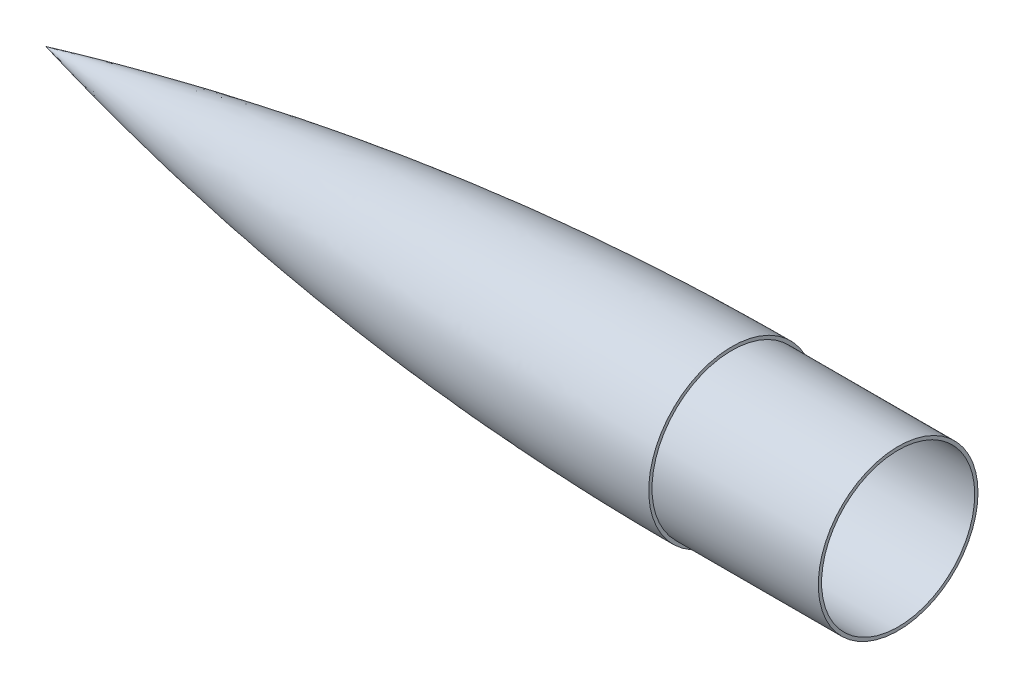
ISO-10303-21;
HEADER;
FILE_DESCRIPTION(('STEP AP214'),'2;1');
FILE_NAME('part.step','',(''),(''),'','','');
FILE_SCHEMA(('AUTOMOTIVE_DESIGN { 1 0 10303 214 1 1 1 1 }'));
ENDSEC;
DATA;
#1=APPLICATION_CONTEXT('core data for automotive mechanical design processes');
#2=APPLICATION_PROTOCOL_DEFINITION('international standard','automotive_design',2000,#1);
#3=PRODUCT_CONTEXT('',#1,'mechanical');
#4=PRODUCT('Part','Part','',(#3));
#5=PRODUCT_RELATED_PRODUCT_CATEGORY('part','',(#4));
#6=PRODUCT_DEFINITION_FORMATION('','',#4);
#7=PRODUCT_DEFINITION_CONTEXT('part definition',#1,'design');
#8=PRODUCT_DEFINITION('design','',#6,#7);
#9=PRODUCT_DEFINITION_SHAPE('','',#8);
#10=(LENGTH_UNIT() NAMED_UNIT(*) SI_UNIT(.MILLI.,.METRE.));
#11=(NAMED_UNIT(*) PLANE_ANGLE_UNIT() SI_UNIT($,.RADIAN.));
#12=(NAMED_UNIT(*) SI_UNIT($,.STERADIAN.) SOLID_ANGLE_UNIT());
#13=UNCERTAINTY_MEASURE_WITH_UNIT(LENGTH_MEASURE(1.E-05),#10,'distance_accuracy_value','');
#14=(GEOMETRIC_REPRESENTATION_CONTEXT(3) GLOBAL_UNCERTAINTY_ASSIGNED_CONTEXT((#13)) GLOBAL_UNIT_ASSIGNED_CONTEXT((#10,
#11,#12)) REPRESENTATION_CONTEXT('',''));
#15=CARTESIAN_POINT('',(0.,0.,0.));
#16=DIRECTION('',(0.,0.,1.));
#17=DIRECTION('',(1.,0.,0.));
#18=AXIS2_PLACEMENT_3D('',#15,#16,#17);
#19=CARTESIAN_POINT('',(101.6,0.,0.));
#20=DIRECTION('',(1.,0.,0.));
#21=DIRECTION('',(0.,0.,-1.));
#22=AXIS2_PLACEMENT_3D('',#19,#20,#21);
#23=PLANE('',#22);
#24=CARTESIAN_POINT('',(101.6,0.,0.));
#25=DIRECTION('',(1.,0.,0.));
#26=DIRECTION('',(0.,0.,-1.));
#27=AXIS2_PLACEMENT_3D('',#24,#25,#26);
#28=CIRCLE('',#27,48.7934);
#29=CARTESIAN_POINT('',(101.6,0.,-48.7934));
#30=VERTEX_POINT('',#29);
#31=EDGE_CURVE('E11',#30,#30,#28,.T.);
#32=ORIENTED_EDGE('',*,*,#31,.T.);
#33=EDGE_LOOP('',(#32));
#34=FACE_BOUND('',#33,.T.);
#35=CARTESIAN_POINT('',(101.6,0.,0.));
#36=DIRECTION('',(1.,0.,0.));
#37=DIRECTION('',(0.,0.,-1.));
#38=AXIS2_PLACEMENT_3D('',#35,#36,#37);
#39=CIRCLE('',#38,46.7868);
#40=CARTESIAN_POINT('',(101.6,0.,-46.7868));
#41=VERTEX_POINT('',#40);
#42=EDGE_CURVE('E58',#41,#41,#39,.T.);
#43=ORIENTED_EDGE('',*,*,#42,.F.);
#44=EDGE_LOOP('',(#43));
#45=FACE_BOUND('',#44,.T.);
#46=ADVANCED_FACE('F47',(#34,#45),#23,.T.);
#47=CARTESIAN_POINT('',(0.,0.,0.));
#48=DIRECTION('',(1.,0.,0.));
#49=DIRECTION('',(0.,0.,-1.));
#50=AXIS2_PLACEMENT_3D('',#47,#48,#49);
#51=PLANE('',#50);
#52=CARTESIAN_POINT('',(0.,0.,0.));
#53=DIRECTION('',(1.,0.,0.));
#54=DIRECTION('',(0.,0.,-1.));
#55=AXIS2_PLACEMENT_3D('',#52,#53,#54);
#56=CIRCLE('',#55,48.7934);
#57=CARTESIAN_POINT('',(0.,0.,-48.7934));
#58=VERTEX_POINT('',#57);
#59=EDGE_CURVE('E51',#58,#58,#56,.T.);
#60=ORIENTED_EDGE('',*,*,#59,.F.);
#61=EDGE_LOOP('',(#60));
#62=FACE_BOUND('',#61,.T.);
#63=CARTESIAN_POINT('',(0.,0.,0.));
#64=DIRECTION('',(1.,0.,0.));
#65=DIRECTION('',(0.,0.,-1.));
#66=AXIS2_PLACEMENT_3D('',#63,#64,#65);
#67=CIRCLE('',#66,46.7868);
#68=CARTESIAN_POINT('',(0.,0.,-46.7868));
#69=VERTEX_POINT('',#68);
#70=EDGE_CURVE('E60',#69,#69,#67,.T.);
#71=ORIENTED_EDGE('',*,*,#70,.T.);
#72=EDGE_LOOP('',(#71));
#73=FACE_BOUND('',#72,.T.);
#74=ADVANCED_FACE('F70',(#62,#73),#51,.F.);
#75=CARTESIAN_POINT('',(101.6,0.,0.));
#76=DIRECTION('',(-1.,0.,0.));
#77=DIRECTION('',(0.,0.,1.));
#78=AXIS2_PLACEMENT_3D('',#75,#76,#77);
#79=CYLINDRICAL_SURFACE('',#78,48.7934);
#80=ORIENTED_EDGE('',*,*,#31,.F.);
#81=EDGE_LOOP('',(#80));
#82=FACE_BOUND('',#81,.T.);
#83=ORIENTED_EDGE('',*,*,#59,.T.);
#84=EDGE_LOOP('',(#83));
#85=FACE_BOUND('',#84,.T.);
#86=ADVANCED_FACE('F49',(#82,#85),#79,.T.);
#87=CARTESIAN_POINT('',(101.6,0.,0.));
#88=DIRECTION('',(-1.,0.,0.));
#89=DIRECTION('',(0.,0.,1.));
#90=AXIS2_PLACEMENT_3D('',#87,#88,#89);
#91=CYLINDRICAL_SURFACE('',#90,46.7868);
#92=ORIENTED_EDGE('',*,*,#42,.T.);
#93=EDGE_LOOP('',(#92));
#94=FACE_BOUND('',#93,.T.);
#95=ORIENTED_EDGE('',*,*,#70,.F.);
#96=EDGE_LOOP('',(#95));
#97=FACE_BOUND('',#96,.T.);
#98=ADVANCED_FACE('F66',(#94,#97),#91,.F.);
#99=CLOSED_SHELL('',(#46,#74,#86,#98));
#100=MANIFOLD_SOLID_BREP('B2',#99);
#101=CARTESIAN_POINT('',(0.,0.,1703.3875));
#102=DIRECTION('',(0.,-1.,0.));
#103=DIRECTION('',(0.,0.,-1.));
#104=AXIS2_PLACEMENT_3D('',#101,#102,#103);
#105=CIRCLE('',#104,1752.1809);
#106=TRIMMED_CURVE('',#105,(PARAMETER_VALUE(-0.236547889684316)),
(PARAMETER_VALUE(0.236547889684316)),.T.,.PARAMETER.);
#107=CARTESIAN_POINT('',(0.,0.,0.));
#108=DIRECTION('',(1.,0.,0.));
#109=AXIS1_PLACEMENT('',#107,#108);
#110=SURFACE_OF_REVOLUTION('',#106,#109);
#111=CARTESIAN_POINT('',(0.,0.,0.));
#112=DIRECTION('',(1.,0.,0.));
#113=DIRECTION('',(0.,0.,-1.));
#114=AXIS2_PLACEMENT_3D('',#111,#112,#113);
#115=CIRCLE('',#114,48.7934000000005);
#116=CARTESIAN_POINT('',(0.,0.,-48.7934000000005));
#117=VERTEX_POINT('',#116);
#118=EDGE_CURVE('E45',#117,#117,#115,.T.);
#119=ORIENTED_EDGE('',*,*,#118,.T.);
#120=EDGE_LOOP('',(#119));
#121=FACE_BOUND('',#120,.T.);
#122=CARTESIAN_POINT('',(-410.620178715759,0.,0.));
#123=VERTEX_POINT('',#122);
#124=VERTEX_LOOP('',#123);
#125=FACE_BOUND('',#124,.T.);
#126=ADVANCED_FACE('F109',(#121,#125),#110,.F.);
#127=CARTESIAN_POINT('',(0.,48.7934000000005,0.));
#128=DIRECTION('',(1.,0.,0.));
#129=DIRECTION('',(0.,0.,-1.));
#130=AXIS2_PLACEMENT_3D('',#127,#128,#129);
#131=PLANE('',#130);
#132=CARTESIAN_POINT('',(1.11022302462516E-13,0.,0.));
#133=DIRECTION('',(1.,0.,0.));
#134=DIRECTION('',(0.,0.,-1.));
#135=AXIS2_PLACEMENT_3D('',#132,#133,#134);
#136=CIRCLE('',#135,50.8);
#137=CARTESIAN_POINT('',(1.11022302462516E-13,0.,-50.8));
#138=VERTEX_POINT('',#137);
#139=EDGE_CURVE('E117',#138,#138,#136,.T.);
#140=ORIENTED_EDGE('',*,*,#139,.T.);
#141=EDGE_LOOP('',(#140));
#142=FACE_BOUND('',#141,.T.);
#143=ORIENTED_EDGE('',*,*,#118,.F.);
#144=EDGE_LOOP('',(#143));
#145=FACE_BOUND('',#144,.T.);
#146=ADVANCED_FACE('F126',(#142,#145),#131,.T.);
#147=CARTESIAN_POINT('',(0.,0.,1703.3875));
#148=DIRECTION('',(0.,-1.,0.));
#149=DIRECTION('',(0.,0.,-1.));
#150=AXIS2_PLACEMENT_3D('',#147,#148,#149);
#151=CIRCLE('',#150,1754.1875);
#152=TRIMMED_CURVE('',#151,(PARAMETER_VALUE(-0.241247337160205)),
(PARAMETER_VALUE(0.241247337160205)),.T.,.PARAMETER.);
#153=CARTESIAN_POINT('',(0.,0.,0.));
#154=DIRECTION('',(1.,0.,0.));
#155=AXIS1_PLACEMENT('',#153,#154);
#156=SURFACE_OF_REVOLUTION('',#152,#155);
#157=CARTESIAN_POINT('',(-419.1,0.,0.));
#158=VERTEX_POINT('',#157);
#159=VERTEX_LOOP('',#158);
#160=FACE_BOUND('',#159,.T.);
#161=ORIENTED_EDGE('',*,*,#139,.F.);
#162=EDGE_LOOP('',(#161));
#163=FACE_BOUND('',#162,.T.);
#164=ADVANCED_FACE('F123',(#160,#163),#156,.T.);
#165=CLOSED_SHELL('',(#126,#146,#164));
#166=MANIFOLD_SOLID_BREP('B6',#165);
#167=ADVANCED_BREP_SHAPE_REPRESENTATION('',(#18,#100,#166),#14);
#168=SHAPE_DEFINITION_REPRESENTATION(#9,#167);
ENDSEC;
END-ISO-10303-21;
